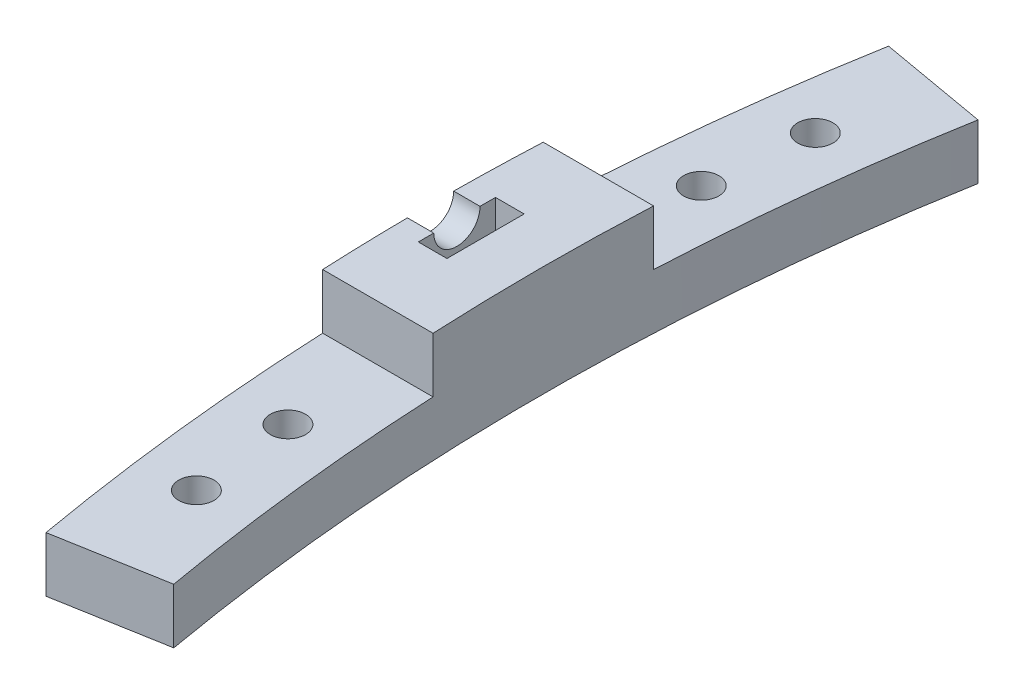
ISO-10303-21;
HEADER;
FILE_DESCRIPTION(('STEP AP214'),'2;1');
FILE_NAME('part.step','',(''),(''),'','','');
FILE_SCHEMA(('AUTOMOTIVE_DESIGN { 1 0 10303 214 1 1 1 1 }'));
ENDSEC;
DATA;
#1=APPLICATION_CONTEXT('core data for automotive mechanical design processes');
#2=APPLICATION_PROTOCOL_DEFINITION('international standard','automotive_design',2000,#1);
#3=PRODUCT_CONTEXT('',#1,'mechanical');
#4=PRODUCT('Part','Part','',(#3));
#5=PRODUCT_RELATED_PRODUCT_CATEGORY('part','',(#4));
#6=PRODUCT_DEFINITION_FORMATION('','',#4);
#7=PRODUCT_DEFINITION_CONTEXT('part definition',#1,'design');
#8=PRODUCT_DEFINITION('design','',#6,#7);
#9=PRODUCT_DEFINITION_SHAPE('','',#8);
#10=(LENGTH_UNIT() NAMED_UNIT(*) SI_UNIT(.MILLI.,.METRE.));
#11=(NAMED_UNIT(*) PLANE_ANGLE_UNIT() SI_UNIT($,.RADIAN.));
#12=(NAMED_UNIT(*) SI_UNIT($,.STERADIAN.) SOLID_ANGLE_UNIT());
#13=UNCERTAINTY_MEASURE_WITH_UNIT(LENGTH_MEASURE(1.E-05),#10,'distance_accuracy_value','');
#14=(GEOMETRIC_REPRESENTATION_CONTEXT(3) GLOBAL_UNCERTAINTY_ASSIGNED_CONTEXT((#13)) GLOBAL_UNIT_ASSIGNED_CONTEXT((#10,
#11,#12)) REPRESENTATION_CONTEXT('',''));
#15=CARTESIAN_POINT('',(0.,0.,0.));
#16=DIRECTION('',(0.,0.,1.));
#17=DIRECTION('',(1.,0.,0.));
#18=AXIS2_PLACEMENT_3D('',#15,#16,#17);
#19=CARTESIAN_POINT('',(0.,5.,0.));
#20=DIRECTION('',(0.,-1.,0.));
#21=DIRECTION('',(0.,0.,-1.));
#22=AXIS2_PLACEMENT_3D('',#19,#20,#21);
#23=CYLINDRICAL_SURFACE('',#22,220.);
#24=CARTESIAN_POINT('',(-219.98997704441,10.,-2.09999999999996));
#25=CARTESIAN_POINT('',(-219.989976911042,9.94092001166468,-2.09999960933127));
#26=CARTESIAN_POINT('',(-219.990000874328,9.88186832983182,-2.09750526136831));
#27=CARTESIAN_POINT('',(-219.99009558057,9.76418752994787,-2.08755430155971));
#28=CARTESIAN_POINT('',(-219.99016632128,9.70555839173003,-2.08009792814349));
#29=CARTESIAN_POINT('',(-219.990446294195,9.53103130266999,-2.05035560793704));
#30=CARTESIAN_POINT('',(-219.990723286023,9.41630250237675,-2.0206962715008));
#31=CARTESIAN_POINT('',(-219.991427221332,9.19345826806721,-1.94253913729725));
#32=CARTESIAN_POINT('',(-219.99185423424,9.08534592328178,-1.89403261626762));
#33=CARTESIAN_POINT('',(-219.992809911719,8.87880452530947,-1.77956461367256));
#34=CARTESIAN_POINT('',(-219.993338556383,8.78037358140999,-1.7136065495979));
#35=CARTESIAN_POINT('',(-219.994438001129,8.59598009621957,-1.56610075067318));
#36=CARTESIAN_POINT('',(-219.995008803336,8.51001818397327,-1.48455222978784));
#37=CARTESIAN_POINT('',(-219.996128281511,8.35299070663296,-1.30816808911268));
#38=CARTESIAN_POINT('',(-219.996676954097,8.28192741208419,-1.21333044773352));
#39=CARTESIAN_POINT('',(-219.997690203637,8.15673428132634,-1.01307236083712));
#40=CARTESIAN_POINT('',(-219.998154782696,8.10260402099252,-0.907652180469999));
#41=CARTESIAN_POINT('',(-219.998947455408,8.01281390068889,-0.689226674319975));
#42=CARTESIAN_POINT('',(-219.999275557818,7.97715285570239,-0.576221835707479));
#43=CARTESIAN_POINT('',(-219.999758327978,7.92530880597583,-0.345829988207032));
#44=CARTESIAN_POINT('',(-219.999912997534,7.90912559841655,-0.22844302496248));
#45=CARTESIAN_POINT('',(-220.000031471933,7.89669592020705,0.00738451151938906));
#46=CARTESIAN_POINT('',(-219.999995272429,7.90044990365298,0.125825108693286));
#47=CARTESIAN_POINT('',(-219.999736085573,7.92778846433782,0.360389746817669));
#48=CARTESIAN_POINT('',(-219.999513106161,7.95137219848229,0.47651388604129));
#49=CARTESIAN_POINT('',(-219.998905508429,8.01769945452566,0.703154144133494));
#50=CARTESIAN_POINT('',(-219.998520890602,8.06044291772954,0.813670280180806));
#51=CARTESIAN_POINT('',(-219.997633354921,8.16387822288017,1.02596260460624));
#52=CARTESIAN_POINT('',(-219.997130432007,8.22457083241111,1.12773841896966));
#53=CARTESIAN_POINT('',(-219.996063019399,8.36217799662551,1.31965130152679));
#54=CARTESIAN_POINT('',(-219.99549853272,8.43909175730337,1.40978893904706));
#55=CARTESIAN_POINT('',(-219.994371656587,8.60695001575968,1.57586522601975));
#56=CARTESIAN_POINT('',(-219.99380926694,8.69789318881817,1.65180521458184));
#57=CARTESIAN_POINT('',(-219.992749751648,8.89127355177964,1.78736372488739));
#58=CARTESIAN_POINT('',(-219.992252646799,8.99371438474762,1.84697705278426));
#59=CARTESIAN_POINT('',(-219.99137969581,9.20719434450346,1.94818705669263));
#60=CARTESIAN_POINT('',(-219.991003923658,9.31823866657928,1.98977274502798));
#61=CARTESIAN_POINT('',(-219.990416998135,9.54564674673725,2.05364706406909));
#62=CARTESIAN_POINT('',(-219.990205593387,9.66200209265238,2.07596516760546));
#63=CARTESIAN_POINT('',(-219.990050937876,9.81594233860317,2.09224582074321));
#64=CARTESIAN_POINT('',(-219.990023241903,9.8527260911862,2.09515517356306));
#65=CARTESIAN_POINT('',(-219.989986319918,9.92633493060579,2.09902960844698));
#66=CARTESIAN_POINT('',(-219.989977063446,9.96315984855561,2.09999789706982));
#67=CARTESIAN_POINT('',(-219.98997704441,10.,2.10000000000004));
#68=B_SPLINE_CURVE_WITH_KNOTS('',3,(#24,#25,#26,#27,#28,#29,#30,#31,#32,#33,#34,#35,#36,#37,#38,
#39,#40,#41,#42,#43,#44,#45,#46,#47,#48,#49,#50,#51,#52,#53,#54,#55,#56,#57,#58,#59,#60,#61,#62,
#63,#64,#65,#66,#67),.UNSPECIFIED.,.F.,.F.,(4,2,2,2,2,2,2,2,2,2,2,2,2,2,2,2,2,2,2,2,2,4),(0.,
0.177131095388177,0.354253680095445,0.707932624361385,1.06177546135122,1.41554905742823,
1.76934049466937,2.12318581049765,2.47702226278944,2.83083600951124,3.1846460720024,
3.53846419302493,3.89226727164912,4.24606926641972,4.59988639350286,4.95368620568603,
5.30745263093121,5.66133146617636,6.01542568501934,6.36897729592022,6.47963752238336,
6.59011479152868),.UNSPECIFIED.);
#69=CARTESIAN_POINT('',(-219.98997704441,10.,-2.09999999999996));
#70=VERTEX_POINT('',#69);
#71=CARTESIAN_POINT('',(-219.98997704441,10.,2.10000000000004));
#72=VERTEX_POINT('',#71);
#73=EDGE_CURVE('E168',#70,#72,#68,.T.);
#74=ORIENTED_EDGE('',*,*,#73,.F.);
#75=CARTESIAN_POINT('',(0.,10.,0.));
#76=DIRECTION('',(0.,1.,0.));
#77=DIRECTION('',(0.,0.,1.));
#78=AXIS2_PLACEMENT_3D('',#75,#76,#77);
#79=CIRCLE('',#78,220.);
#80=CARTESIAN_POINT('',(-219.772609758359,10.,-9.99999999999996));
#81=VERTEX_POINT('',#80);
#82=EDGE_CURVE('E145',#81,#70,#79,.T.);
#83=ORIENTED_EDGE('',*,*,#82,.F.);
#84=DIRECTION('',(0.,-1.,0.));
#85=VECTOR('',#84,1.);
#86=CARTESIAN_POINT('',(-219.772609758359,10.,-9.99999999999996));
#87=LINE('',#86,#85);
#88=CARTESIAN_POINT('',(-219.772609758359,5.,-9.99999999999996));
#89=VERTEX_POINT('',#88);
#90=EDGE_CURVE('E184',#81,#89,#87,.T.);
#91=ORIENTED_EDGE('',*,*,#90,.T.);
#92=CARTESIAN_POINT('',(0.,5.,0.));
#93=DIRECTION('',(0.,1.,0.));
#94=DIRECTION('',(0.,0.,1.));
#95=AXIS2_PLACEMENT_3D('',#92,#93,#94);
#96=CIRCLE('',#95,220.);
#97=CARTESIAN_POINT('',(-216.657705662686,5.,-38.2025990867247));
#98=VERTEX_POINT('',#97);
#99=EDGE_CURVE('E226',#98,#89,#96,.T.);
#100=ORIENTED_EDGE('',*,*,#99,.F.);
#101=DIRECTION('',(0.,-1.,0.));
#102=VECTOR('',#101,1.);
#103=CARTESIAN_POINT('',(-216.657705662686,5.,-38.2025990867247));
#104=LINE('',#103,#102);
#105=CARTESIAN_POINT('',(-216.657705662686,0.,-38.2025990867247));
#106=VERTEX_POINT('',#105);
#107=EDGE_CURVE('E236',#98,#106,#104,.T.);
#108=ORIENTED_EDGE('',*,*,#107,.T.);
#109=CARTESIAN_POINT('',(0.,0.,0.));
#110=DIRECTION('',(0.,1.,0.));
#111=DIRECTION('',(0.,0.,1.));
#112=AXIS2_PLACEMENT_3D('',#109,#110,#111);
#113=CIRCLE('',#112,220.);
#114=CARTESIAN_POINT('',(-216.657705662686,0.,38.2025990867248));
#115=VERTEX_POINT('',#114);
#116=EDGE_CURVE('E225',#106,#115,#113,.T.);
#117=ORIENTED_EDGE('',*,*,#116,.T.);
#118=DIRECTION('',(0.,-1.,0.));
#119=VECTOR('',#118,1.);
#120=CARTESIAN_POINT('',(-216.657705662686,5.,38.2025990867248));
#121=LINE('',#120,#119);
#122=CARTESIAN_POINT('',(-216.657705662686,5.,38.2025990867248));
#123=VERTEX_POINT('',#122);
#124=EDGE_CURVE('E253',#123,#115,#121,.T.);
#125=ORIENTED_EDGE('',*,*,#124,.F.);
#126=CARTESIAN_POINT('',(-219.772609758359,5.,10.));
#127=VERTEX_POINT('',#126);
#128=EDGE_CURVE('E229',#127,#123,#96,.T.);
#129=ORIENTED_EDGE('',*,*,#128,.F.);
#130=DIRECTION('',(0.,-1.,0.));
#131=VECTOR('',#130,1.);
#132=CARTESIAN_POINT('',(-219.772609758359,10.,10.));
#133=LINE('',#132,#131);
#134=CARTESIAN_POINT('',(-219.772609758359,10.,10.));
#135=VERTEX_POINT('',#134);
#136=EDGE_CURVE('E198',#135,#127,#133,.T.);
#137=ORIENTED_EDGE('',*,*,#136,.F.);
#138=EDGE_CURVE('E178',#72,#135,#79,.T.);
#139=ORIENTED_EDGE('',*,*,#138,.F.);
#140=EDGE_LOOP('',(#74,#83,#91,#100,#108,#117,#125,#129,#137,#139));
#141=FACE_BOUND('',#140,.T.);
#142=ADVANCED_FACE('F34',(#141),#23,.T.);
#143=CARTESIAN_POINT('',(0.,10.,0.));
#144=DIRECTION('',(0.,1.,0.));
#145=DIRECTION('',(0.,0.,1.));
#146=AXIS2_PLACEMENT_3D('',#143,#144,#145);
#147=PLANE('',#146);
#148=DIRECTION('',(0.,0.,1.));
#149=VECTOR('',#148,1.);
#150=CARTESIAN_POINT('',(-217.6,10.,0.));
#151=LINE('',#150,#149);
#152=CARTESIAN_POINT('',(-217.6,10.,2.10000000000004));
#153=VERTEX_POINT('',#152);
#154=CARTESIAN_POINT('',(-217.6,10.,3.50000000000003));
#155=VERTEX_POINT('',#154);
#156=EDGE_CURVE('E42',#153,#155,#151,.T.);
#157=ORIENTED_EDGE('',*,*,#156,.F.);
#158=DIRECTION('',(1.,0.,0.));
#159=VECTOR('',#158,1.);
#160=CARTESIAN_POINT('',(-220.,10.,2.10000000000004));
#161=LINE('',#160,#159);
#162=EDGE_CURVE('E49',#153,#72,#161,.F.);
#163=ORIENTED_EDGE('',*,*,#162,.T.);
#164=ORIENTED_EDGE('',*,*,#138,.T.);
#165=DIRECTION('',(1.,0.,0.));
#166=VECTOR('',#165,1.);
#167=CARTESIAN_POINT('',(-219.772609758359,10.,10.));
#168=LINE('',#167,#166);
#169=CARTESIAN_POINT('',(-209.76176963403,10.,10.));
#170=VERTEX_POINT('',#169);
#171=EDGE_CURVE('E177',#135,#170,#168,.T.);
#172=ORIENTED_EDGE('',*,*,#171,.T.);
#173=CARTESIAN_POINT('',(0.,10.,0.));
#174=DIRECTION('',(0.,-1.,0.));
#175=DIRECTION('',(0.,0.,1.));
#176=AXIS2_PLACEMENT_3D('',#173,#174,#175);
#177=CIRCLE('',#176,210.);
#178=CARTESIAN_POINT('',(-209.76176963403,10.,-10.0000000000001));
#179=VERTEX_POINT('',#178);
#180=EDGE_CURVE('E180',#170,#179,#177,.T.);
#181=ORIENTED_EDGE('',*,*,#180,.T.);
#182=DIRECTION('',(-1.,0.,0.));
#183=VECTOR('',#182,1.);
#184=CARTESIAN_POINT('',(-219.772609758359,10.,-9.99999999999996));
#185=LINE('',#184,#183);
#186=EDGE_CURVE('E182',#179,#81,#185,.T.);
#187=ORIENTED_EDGE('',*,*,#186,.T.);
#188=ORIENTED_EDGE('',*,*,#82,.T.);
#189=DIRECTION('',(1.,0.,0.));
#190=VECTOR('',#189,1.);
#191=CARTESIAN_POINT('',(-220.,10.,-2.09999999999996));
#192=LINE('',#191,#190);
#193=CARTESIAN_POINT('',(-217.6,10.,-2.09999999999996));
#194=VERTEX_POINT('',#193);
#195=EDGE_CURVE('E136',#70,#194,#192,.T.);
#196=ORIENTED_EDGE('',*,*,#195,.T.);
#197=CARTESIAN_POINT('',(-217.6,10.,-3.49999999999997));
#198=VERTEX_POINT('',#197);
#199=EDGE_CURVE('E11',#198,#194,#151,.T.);
#200=ORIENTED_EDGE('',*,*,#199,.F.);
#201=DIRECTION('',(1.,0.,0.));
#202=VECTOR('',#201,1.);
#203=CARTESIAN_POINT('',(0.,10.,-3.5));
#204=LINE('',#203,#202);
#205=CARTESIAN_POINT('',(-215.,10.,-3.49999999999997));
#206=VERTEX_POINT('',#205);
#207=EDGE_CURVE('E257',#198,#206,#204,.T.);
#208=ORIENTED_EDGE('',*,*,#207,.T.);
#209=DIRECTION('',(0.,0.,1.));
#210=VECTOR('',#209,1.);
#211=CARTESIAN_POINT('',(-215.,10.,0.));
#212=LINE('',#211,#210);
#213=CARTESIAN_POINT('',(-215.,10.,3.50000000000003));
#214=VERTEX_POINT('',#213);
#215=EDGE_CURVE('E57',#206,#214,#212,.T.);
#216=ORIENTED_EDGE('',*,*,#215,.T.);
#217=DIRECTION('',(-1.,0.,0.));
#218=VECTOR('',#217,1.);
#219=CARTESIAN_POINT('',(0.,10.,3.5));
#220=LINE('',#219,#218);
#221=EDGE_CURVE('E258',#214,#155,#220,.T.);
#222=ORIENTED_EDGE('',*,*,#221,.T.);
#223=EDGE_LOOP('',(#157,#163,#164,#172,#181,#187,#188,#196,#200,#208,#216,#222));
#224=FACE_BOUND('',#223,.T.);
#225=ADVANCED_FACE('F143',(#224),#147,.T.);
#226=CARTESIAN_POINT('',(0.,5.,0.));
#227=DIRECTION('',(0.,1.,0.));
#228=DIRECTION('',(0.,0.,1.));
#229=AXIS2_PLACEMENT_3D('',#226,#227,#228);
#230=PLANE('',#229);
#231=DIRECTION('',(-1.,0.,0.));
#232=VECTOR('',#231,1.);
#233=CARTESIAN_POINT('',(-219.772609758359,5.,-9.99999999999996));
#234=LINE('',#233,#232);
#235=CARTESIAN_POINT('',(-209.76176963403,5.,-9.99999999999996));
#236=VERTEX_POINT('',#235);
#237=EDGE_CURVE('E187',#236,#89,#234,.T.);
#238=ORIENTED_EDGE('',*,*,#237,.F.);
#239=CARTESIAN_POINT('',(0.,5.,0.));
#240=DIRECTION('',(0.,-1.,0.));
#241=DIRECTION('',(0.,0.,1.));
#242=AXIS2_PLACEMENT_3D('',#239,#240,#241);
#243=CIRCLE('',#242,210.);
#244=CARTESIAN_POINT('',(-206.809628132564,5.,-36.4661173100554));
#245=VERTEX_POINT('',#244);
#246=EDGE_CURVE('E231',#236,#245,#243,.T.);
#247=ORIENTED_EDGE('',*,*,#246,.T.);
#248=DIRECTION('',(-0.984807753012208,0.,-0.173648177666932));
#249=VECTOR('',#248,1.);
#250=CARTESIAN_POINT('',(-216.657705662686,5.,-38.2025990867247));
#251=LINE('',#250,#249);
#252=EDGE_CURVE('E234',#245,#98,#251,.T.);
#253=ORIENTED_EDGE('',*,*,#252,.T.);
#254=ORIENTED_EDGE('',*,*,#99,.T.);
#255=EDGE_LOOP('',(#238,#247,#253,#254));
#256=FACE_BOUND('',#255,.T.);
#257=CARTESIAN_POINT('',(-213.160645195369,5.,-28.0631313273112));
#258=DIRECTION('',(0.,-1.,0.));
#259=DIRECTION('',(0.,0.,-1.));
#260=AXIS2_PLACEMENT_3D('',#257,#258,#259);
#261=CIRCLE('',#260,1.59999999999999);
#262=CARTESIAN_POINT('',(-213.160645195369,5.,-29.6631313273112));
#263=VERTEX_POINT('',#262);
#264=EDGE_CURVE('E222',#263,#263,#261,.T.);
#265=ORIENTED_EDGE('',*,*,#264,.T.);
#266=EDGE_LOOP('',(#265));
#267=FACE_BOUND('',#266,.T.);
#268=CARTESIAN_POINT('',(-214.181860089725,5.,-18.7384846907466));
#269=DIRECTION('',(0.,-1.,0.));
#270=DIRECTION('',(0.,0.,-1.));
#271=AXIS2_PLACEMENT_3D('',#268,#269,#270);
#272=CIRCLE('',#271,1.59999999999999);
#273=CARTESIAN_POINT('',(-214.181860089725,5.,-20.3384846907466));
#274=VERTEX_POINT('',#273);
#275=EDGE_CURVE('E210',#274,#274,#272,.T.);
#276=ORIENTED_EDGE('',*,*,#275,.T.);
#277=EDGE_LOOP('',(#276));
#278=FACE_BOUND('',#277,.T.);
#279=ADVANCED_FACE('F285',(#256,#267,#278),#230,.T.);
#280=CARTESIAN_POINT('',(-206.809628132564,5.,36.4661173100555));
#281=DIRECTION('',(-0.173648177666932,0.,-0.984807753012208));
#282=DIRECTION('',(-0.984807753012208,0.,0.173648177666932));
#283=AXIS2_PLACEMENT_3D('',#280,#281,#282);
#284=PLANE('',#283);
#285=DIRECTION('',(0.984807753012208,0.,-0.173648177666932));
#286=VECTOR('',#285,1.);
#287=CARTESIAN_POINT('',(-206.809628132564,0.,36.4661173100555));
#288=LINE('',#287,#286);
#289=CARTESIAN_POINT('',(-206.809628132564,0.,36.4661173100555));
#290=VERTEX_POINT('',#289);
#291=EDGE_CURVE('E239',#115,#290,#288,.T.);
#292=ORIENTED_EDGE('',*,*,#291,.T.);
#293=DIRECTION('',(0.,-1.,0.));
#294=VECTOR('',#293,1.);
#295=CARTESIAN_POINT('',(-206.809628132564,5.,36.4661173100555));
#296=LINE('',#295,#294);
#297=CARTESIAN_POINT('',(-206.809628132564,5.,36.4661173100555));
#298=VERTEX_POINT('',#297);
#299=EDGE_CURVE('E250',#298,#290,#296,.T.);
#300=ORIENTED_EDGE('',*,*,#299,.F.);
#301=DIRECTION('',(0.984807753012208,0.,-0.173648177666932));
#302=VECTOR('',#301,1.);
#303=CARTESIAN_POINT('',(-206.809628132564,5.,36.4661173100555));
#304=LINE('',#303,#302);
#305=EDGE_CURVE('E228',#123,#298,#304,.T.);
#306=ORIENTED_EDGE('',*,*,#305,.F.);
#307=ORIENTED_EDGE('',*,*,#124,.T.);
#308=EDGE_LOOP('',(#292,#300,#306,#307));
#309=FACE_BOUND('',#308,.T.);
#310=ADVANCED_FACE('F308',(#309),#284,.F.);
#311=CARTESIAN_POINT('',(0.,5.,0.));
#312=DIRECTION('',(0.,-1.,0.));
#313=DIRECTION('',(0.,0.,-1.));
#314=AXIS2_PLACEMENT_3D('',#311,#312,#313);
#315=CYLINDRICAL_SURFACE('',#314,210.);
#316=CARTESIAN_POINT('',(0.,0.,0.));
#317=DIRECTION('',(0.,-1.,0.));
#318=DIRECTION('',(0.,0.,1.));
#319=AXIS2_PLACEMENT_3D('',#316,#317,#318);
#320=CIRCLE('',#319,210.);
#321=CARTESIAN_POINT('',(-206.809628132564,0.,-36.4661173100554));
#322=VERTEX_POINT('',#321);
#323=EDGE_CURVE('E241',#290,#322,#320,.T.);
#324=ORIENTED_EDGE('',*,*,#323,.T.);
#325=DIRECTION('',(0.,-1.,0.));
#326=VECTOR('',#325,1.);
#327=CARTESIAN_POINT('',(-206.809628132564,5.,-36.4661173100554));
#328=LINE('',#327,#326);
#329=EDGE_CURVE('E247',#245,#322,#328,.T.);
#330=ORIENTED_EDGE('',*,*,#329,.F.);
#331=ORIENTED_EDGE('',*,*,#246,.F.);
#332=DIRECTION('',(0.,-1.,0.));
#333=VECTOR('',#332,1.);
#334=CARTESIAN_POINT('',(-209.76176963403,10.,-10.0000000000001));
#335=LINE('',#334,#333);
#336=EDGE_CURVE('E192',#179,#236,#335,.T.);
#337=ORIENTED_EDGE('',*,*,#336,.F.);
#338=ORIENTED_EDGE('',*,*,#180,.F.);
#339=DIRECTION('',(0.,-1.,0.));
#340=VECTOR('',#339,1.);
#341=CARTESIAN_POINT('',(-209.76176963403,10.,10.));
#342=LINE('',#341,#340);
#343=CARTESIAN_POINT('',(-209.76176963403,5.,10.));
#344=VERTEX_POINT('',#343);
#345=EDGE_CURVE('E195',#170,#344,#342,.T.);
#346=ORIENTED_EDGE('',*,*,#345,.T.);
#347=EDGE_CURVE('E232',#298,#344,#243,.T.);
#348=ORIENTED_EDGE('',*,*,#347,.F.);
#349=ORIENTED_EDGE('',*,*,#299,.T.);
#350=EDGE_LOOP('',(#324,#330,#331,#337,#338,#346,#348,#349));
#351=FACE_BOUND('',#350,.T.);
#352=ADVANCED_FACE('F312',(#351),#315,.F.);
#353=CARTESIAN_POINT('',(-216.657705662686,5.,-38.2025990867247));
#354=DIRECTION('',(-0.173648177666932,0.,0.984807753012208));
#355=DIRECTION('',(0.984807753012208,0.,0.173648177666932));
#356=AXIS2_PLACEMENT_3D('',#353,#354,#355);
#357=PLANE('',#356);
#358=DIRECTION('',(-0.984807753012208,0.,-0.173648177666932));
#359=VECTOR('',#358,1.);
#360=CARTESIAN_POINT('',(-216.657705662686,0.,-38.2025990867247));
#361=LINE('',#360,#359);
#362=EDGE_CURVE('E243',#322,#106,#361,.T.);
#363=ORIENTED_EDGE('',*,*,#362,.T.);
#364=ORIENTED_EDGE('',*,*,#107,.F.);
#365=ORIENTED_EDGE('',*,*,#252,.F.);
#366=ORIENTED_EDGE('',*,*,#329,.T.);
#367=EDGE_LOOP('',(#363,#364,#365,#366));
#368=FACE_BOUND('',#367,.T.);
#369=ADVANCED_FACE('F327',(#368),#357,.F.);
#370=DIRECTION('',(1.,0.,0.));
#371=VECTOR('',#370,1.);
#372=CARTESIAN_POINT('',(-219.772609758359,5.,10.));
#373=LINE('',#372,#371);
#374=EDGE_CURVE('E175',#127,#344,#373,.T.);
#375=ORIENTED_EDGE('',*,*,#374,.F.);
#376=ORIENTED_EDGE('',*,*,#128,.T.);
#377=ORIENTED_EDGE('',*,*,#305,.T.);
#378=ORIENTED_EDGE('',*,*,#347,.T.);
#379=EDGE_LOOP('',(#375,#376,#377,#378));
#380=FACE_BOUND('',#379,.T.);
#381=CARTESIAN_POINT('',(-214.181860089725,5.,18.7384846907465));
#382=DIRECTION('',(0.,-1.,0.));
#383=DIRECTION('',(0.,0.,-1.));
#384=AXIS2_PLACEMENT_3D('',#381,#382,#383);
#385=CIRCLE('',#384,1.59999999999999);
#386=CARTESIAN_POINT('',(-214.181860089725,5.,17.1384846907466));
#387=VERTEX_POINT('',#386);
#388=EDGE_CURVE('E204',#387,#387,#385,.T.);
#389=ORIENTED_EDGE('',*,*,#388,.T.);
#390=EDGE_LOOP('',(#389));
#391=FACE_BOUND('',#390,.T.);
#392=CARTESIAN_POINT('',(-213.160645195369,5.,28.0631313273111));
#393=DIRECTION('',(0.,-1.,0.));
#394=DIRECTION('',(0.,0.,-1.));
#395=AXIS2_PLACEMENT_3D('',#392,#393,#394);
#396=CIRCLE('',#395,1.59999999999999);
#397=CARTESIAN_POINT('',(-213.160645195369,5.,26.4631313273111));
#398=VERTEX_POINT('',#397);
#399=EDGE_CURVE('E216',#398,#398,#396,.T.);
#400=ORIENTED_EDGE('',*,*,#399,.T.);
#401=EDGE_LOOP('',(#400));
#402=FACE_BOUND('',#401,.T.);
#403=ADVANCED_FACE('F304',(#380,#391,#402),#230,.T.);
#404=CARTESIAN_POINT('',(0.,0.,0.));
#405=DIRECTION('',(0.,1.,0.));
#406=DIRECTION('',(0.,0.,1.));
#407=AXIS2_PLACEMENT_3D('',#404,#405,#406);
#408=PLANE('',#407);
#409=CARTESIAN_POINT('',(-214.181860089725,0.,18.7384846907465));
#410=DIRECTION('',(0.,-1.,0.));
#411=DIRECTION('',(0.,0.,-1.));
#412=AXIS2_PLACEMENT_3D('',#409,#410,#411);
#413=CIRCLE('',#412,1.59999999999999);
#414=CARTESIAN_POINT('',(-214.181860089725,0.,17.1384846907466));
#415=VERTEX_POINT('',#414);
#416=EDGE_CURVE('E201',#415,#415,#413,.T.);
#417=ORIENTED_EDGE('',*,*,#416,.F.);
#418=EDGE_LOOP('',(#417));
#419=FACE_BOUND('',#418,.T.);
#420=CARTESIAN_POINT('',(-214.181860089725,0.,-18.7384846907466));
#421=DIRECTION('',(0.,-1.,0.));
#422=DIRECTION('',(0.,0.,-1.));
#423=AXIS2_PLACEMENT_3D('',#420,#421,#422);
#424=CIRCLE('',#423,1.59999999999999);
#425=CARTESIAN_POINT('',(-214.181860089725,0.,-20.3384846907466));
#426=VERTEX_POINT('',#425);
#427=EDGE_CURVE('E207',#426,#426,#424,.T.);
#428=ORIENTED_EDGE('',*,*,#427,.F.);
#429=EDGE_LOOP('',(#428));
#430=FACE_BOUND('',#429,.T.);
#431=CARTESIAN_POINT('',(-213.160645195369,0.,28.0631313273111));
#432=DIRECTION('',(0.,-1.,0.));
#433=DIRECTION('',(0.,0.,-1.));
#434=AXIS2_PLACEMENT_3D('',#431,#432,#433);
#435=CIRCLE('',#434,1.59999999999999);
#436=CARTESIAN_POINT('',(-213.160645195369,0.,26.4631313273111));
#437=VERTEX_POINT('',#436);
#438=EDGE_CURVE('E213',#437,#437,#435,.T.);
#439=ORIENTED_EDGE('',*,*,#438,.F.);
#440=EDGE_LOOP('',(#439));
#441=FACE_BOUND('',#440,.T.);
#442=CARTESIAN_POINT('',(-213.160645195369,0.,-28.0631313273112));
#443=DIRECTION('',(0.,-1.,0.));
#444=DIRECTION('',(0.,0.,-1.));
#445=AXIS2_PLACEMENT_3D('',#442,#443,#444);
#446=CIRCLE('',#445,1.59999999999999);
#447=CARTESIAN_POINT('',(-213.160645195369,0.,-29.6631313273112));
#448=VERTEX_POINT('',#447);
#449=EDGE_CURVE('E219',#448,#448,#446,.T.);
#450=ORIENTED_EDGE('',*,*,#449,.F.);
#451=EDGE_LOOP('',(#450));
#452=FACE_BOUND('',#451,.T.);
#453=ORIENTED_EDGE('',*,*,#116,.F.);
#454=ORIENTED_EDGE('',*,*,#362,.F.);
#455=ORIENTED_EDGE('',*,*,#323,.F.);
#456=ORIENTED_EDGE('',*,*,#291,.F.);
#457=EDGE_LOOP('',(#453,#454,#455,#456));
#458=FACE_BOUND('',#457,.T.);
#459=ADVANCED_FACE('F330',(#419,#430,#441,#452,#458),#408,.F.);
#460=CARTESIAN_POINT('',(-213.160645195369,0.,-28.0631313273112));
#461=DIRECTION('',(0.,-1.,0.));
#462=DIRECTION('',(0.,0.,-1.));
#463=AXIS2_PLACEMENT_3D('',#460,#461,#462);
#464=CYLINDRICAL_SURFACE('',#463,1.59999999999999);
#465=ORIENTED_EDGE('',*,*,#264,.F.);
#466=EDGE_LOOP('',(#465));
#467=FACE_BOUND('',#466,.T.);
#468=ORIENTED_EDGE('',*,*,#449,.T.);
#469=EDGE_LOOP('',(#468));
#470=FACE_BOUND('',#469,.T.);
#471=ADVANCED_FACE('F332',(#467,#470),#464,.F.);
#472=CARTESIAN_POINT('',(-213.160645195369,0.,28.0631313273111));
#473=DIRECTION('',(0.,-1.,0.));
#474=DIRECTION('',(0.,0.,-1.));
#475=AXIS2_PLACEMENT_3D('',#472,#473,#474);
#476=CYLINDRICAL_SURFACE('',#475,1.59999999999999);
#477=ORIENTED_EDGE('',*,*,#399,.F.);
#478=EDGE_LOOP('',(#477));
#479=FACE_BOUND('',#478,.T.);
#480=ORIENTED_EDGE('',*,*,#438,.T.);
#481=EDGE_LOOP('',(#480));
#482=FACE_BOUND('',#481,.T.);
#483=ADVANCED_FACE('F339',(#479,#482),#476,.F.);
#484=CARTESIAN_POINT('',(-214.181860089725,0.,-18.7384846907466));
#485=DIRECTION('',(0.,-1.,0.));
#486=DIRECTION('',(0.,0.,-1.));
#487=AXIS2_PLACEMENT_3D('',#484,#485,#486);
#488=CYLINDRICAL_SURFACE('',#487,1.59999999999999);
#489=ORIENTED_EDGE('',*,*,#275,.F.);
#490=EDGE_LOOP('',(#489));
#491=FACE_BOUND('',#490,.T.);
#492=ORIENTED_EDGE('',*,*,#427,.T.);
#493=EDGE_LOOP('',(#492));
#494=FACE_BOUND('',#493,.T.);
#495=ADVANCED_FACE('F422',(#491,#494),#488,.F.);
#496=CARTESIAN_POINT('',(-214.181860089725,0.,18.7384846907465));
#497=DIRECTION('',(0.,-1.,0.));
#498=DIRECTION('',(0.,0.,-1.));
#499=AXIS2_PLACEMENT_3D('',#496,#497,#498);
#500=CYLINDRICAL_SURFACE('',#499,1.59999999999999);
#501=ORIENTED_EDGE('',*,*,#388,.F.);
#502=EDGE_LOOP('',(#501));
#503=FACE_BOUND('',#502,.T.);
#504=ORIENTED_EDGE('',*,*,#416,.T.);
#505=EDGE_LOOP('',(#504));
#506=FACE_BOUND('',#505,.T.);
#507=ADVANCED_FACE('F415',(#503,#506),#500,.F.);
#508=CARTESIAN_POINT('',(-219.772609758359,10.,10.));
#509=DIRECTION('',(0.,0.,-1.));
#510=DIRECTION('',(-1.,0.,0.));
#511=AXIS2_PLACEMENT_3D('',#508,#509,#510);
#512=PLANE('',#511);
#513=ORIENTED_EDGE('',*,*,#374,.T.);
#514=ORIENTED_EDGE('',*,*,#345,.F.);
#515=ORIENTED_EDGE('',*,*,#171,.F.);
#516=ORIENTED_EDGE('',*,*,#136,.T.);
#517=EDGE_LOOP('',(#513,#514,#515,#516));
#518=FACE_BOUND('',#517,.T.);
#519=ADVANCED_FACE('F298',(#518),#512,.F.);
#520=CARTESIAN_POINT('',(-219.772609758359,10.,-9.99999999999996));
#521=DIRECTION('',(0.,0.,1.));
#522=DIRECTION('',(1.,0.,0.));
#523=AXIS2_PLACEMENT_3D('',#520,#521,#522);
#524=PLANE('',#523);
#525=ORIENTED_EDGE('',*,*,#237,.T.);
#526=ORIENTED_EDGE('',*,*,#90,.F.);
#527=ORIENTED_EDGE('',*,*,#186,.F.);
#528=ORIENTED_EDGE('',*,*,#336,.T.);
#529=EDGE_LOOP('',(#525,#526,#527,#528));
#530=FACE_BOUND('',#529,.T.);
#531=ADVANCED_FACE('F318',(#530),#524,.F.);
#532=CARTESIAN_POINT('',(-217.6,13.5,3.50000000000003));
#533=DIRECTION('',(0.,0.,-1.));
#534=DIRECTION('',(0.,1.,0.));
#535=AXIS2_PLACEMENT_3D('',#532,#533,#534);
#536=PLANE('',#535);
#537=DIRECTION('',(0.,1.,0.));
#538=VECTOR('',#537,1.);
#539=CARTESIAN_POINT('',(-215.,13.5,3.50000000000003));
#540=LINE('',#539,#538);
#541=CARTESIAN_POINT('',(-215.,6.5,3.50000000000003));
#542=VERTEX_POINT('',#541);
#543=EDGE_CURVE('E165',#542,#214,#540,.T.);
#544=ORIENTED_EDGE('',*,*,#543,.F.);
#545=DIRECTION('',(1.,0.,0.));
#546=VECTOR('',#545,1.);
#547=CARTESIAN_POINT('',(-217.6,6.5,3.50000000000003));
#548=LINE('',#547,#546);
#549=CARTESIAN_POINT('',(-217.6,6.5,3.50000000000003));
#550=VERTEX_POINT('',#549);
#551=EDGE_CURVE('E158',#550,#542,#548,.T.);
#552=ORIENTED_EDGE('',*,*,#551,.F.);
#553=DIRECTION('',(0.,1.,0.));
#554=VECTOR('',#553,1.);
#555=CARTESIAN_POINT('',(-217.6,13.5,3.50000000000003));
#556=LINE('',#555,#554);
#557=EDGE_CURVE('E156',#550,#155,#556,.T.);
#558=ORIENTED_EDGE('',*,*,#557,.T.);
#559=ORIENTED_EDGE('',*,*,#221,.F.);
#560=EDGE_LOOP('',(#544,#552,#558,#559));
#561=FACE_BOUND('',#560,.T.);
#562=ADVANCED_FACE('F263',(#561),#536,.T.);
#563=CARTESIAN_POINT('',(-217.6,13.5,-3.49999999999997));
#564=DIRECTION('',(0.,0.,1.));
#565=DIRECTION('',(0.,-1.,0.));
#566=AXIS2_PLACEMENT_3D('',#563,#564,#565);
#567=PLANE('',#566);
#568=DIRECTION('',(0.,-1.,0.));
#569=VECTOR('',#568,1.);
#570=CARTESIAN_POINT('',(-217.6,13.5,-3.49999999999997));
#571=LINE('',#570,#569);
#572=CARTESIAN_POINT('',(-217.6,6.5,-3.49999999999997));
#573=VERTEX_POINT('',#572);
#574=EDGE_CURVE('E150',#198,#573,#571,.T.);
#575=ORIENTED_EDGE('',*,*,#574,.T.);
#576=DIRECTION('',(1.,0.,0.));
#577=VECTOR('',#576,1.);
#578=CARTESIAN_POINT('',(-217.6,6.5,-3.49999999999997));
#579=LINE('',#578,#577);
#580=CARTESIAN_POINT('',(-215.,6.5,-3.49999999999997));
#581=VERTEX_POINT('',#580);
#582=EDGE_CURVE('E173',#573,#581,#579,.T.);
#583=ORIENTED_EDGE('',*,*,#582,.T.);
#584=DIRECTION('',(0.,-1.,0.));
#585=VECTOR('',#584,1.);
#586=CARTESIAN_POINT('',(-215.,13.5,-3.49999999999997));
#587=LINE('',#586,#585);
#588=EDGE_CURVE('E167',#206,#581,#587,.T.);
#589=ORIENTED_EDGE('',*,*,#588,.F.);
#590=ORIENTED_EDGE('',*,*,#207,.F.);
#591=EDGE_LOOP('',(#575,#583,#589,#590));
#592=FACE_BOUND('',#591,.T.);
#593=ADVANCED_FACE('F268',(#592),#567,.T.);
#594=CARTESIAN_POINT('',(-217.6,6.5,-3.49999999999997));
#595=DIRECTION('',(0.,1.,0.));
#596=DIRECTION('',(0.,0.,1.));
#597=AXIS2_PLACEMENT_3D('',#594,#595,#596);
#598=PLANE('',#597);
#599=DIRECTION('',(0.,0.,1.));
#600=VECTOR('',#599,1.);
#601=CARTESIAN_POINT('',(-215.,6.5,-3.49999999999997));
#602=LINE('',#601,#600);
#603=EDGE_CURVE('E161',#581,#542,#602,.T.);
#604=ORIENTED_EDGE('',*,*,#603,.F.);
#605=ORIENTED_EDGE('',*,*,#582,.F.);
#606=DIRECTION('',(0.,0.,1.));
#607=VECTOR('',#606,1.);
#608=CARTESIAN_POINT('',(-217.6,6.5,-3.49999999999997));
#609=LINE('',#608,#607);
#610=EDGE_CURVE('E152',#573,#550,#609,.T.);
#611=ORIENTED_EDGE('',*,*,#610,.T.);
#612=ORIENTED_EDGE('',*,*,#551,.T.);
#613=EDGE_LOOP('',(#604,#605,#611,#612));
#614=FACE_BOUND('',#613,.T.);
#615=ADVANCED_FACE('F266',(#614),#598,.T.);
#616=CARTESIAN_POINT('',(-217.6,0.,0.));
#617=DIRECTION('',(-1.,0.,0.));
#618=DIRECTION('',(0.,0.,1.));
#619=AXIS2_PLACEMENT_3D('',#616,#617,#618);
#620=PLANE('',#619);
#621=CARTESIAN_POINT('',(-217.6,10.,0.));
#622=DIRECTION('',(-1.,0.,0.));
#623=DIRECTION('',(0.,0.,1.));
#624=AXIS2_PLACEMENT_3D('',#621,#622,#623);
#625=CIRCLE('',#624,2.1);
#626=EDGE_CURVE('E133',#153,#194,#625,.F.);
#627=ORIENTED_EDGE('',*,*,#626,.F.);
#628=ORIENTED_EDGE('',*,*,#156,.T.);
#629=ORIENTED_EDGE('',*,*,#557,.F.);
#630=ORIENTED_EDGE('',*,*,#610,.F.);
#631=ORIENTED_EDGE('',*,*,#574,.F.);
#632=ORIENTED_EDGE('',*,*,#199,.T.);
#633=EDGE_LOOP('',(#627,#628,#629,#630,#631,#632));
#634=FACE_BOUND('',#633,.T.);
#635=ADVANCED_FACE('F148',(#634),#620,.F.);
#636=CARTESIAN_POINT('',(-215.,0.,0.));
#637=DIRECTION('',(-1.,0.,0.));
#638=DIRECTION('',(0.,0.,1.));
#639=AXIS2_PLACEMENT_3D('',#636,#637,#638);
#640=PLANE('',#639);
#641=ORIENTED_EDGE('',*,*,#543,.T.);
#642=ORIENTED_EDGE('',*,*,#215,.F.);
#643=ORIENTED_EDGE('',*,*,#588,.T.);
#644=ORIENTED_EDGE('',*,*,#603,.T.);
#645=EDGE_LOOP('',(#641,#642,#643,#644));
#646=FACE_BOUND('',#645,.T.);
#647=ADVANCED_FACE('F270',(#646),#640,.T.);
#648=CARTESIAN_POINT('',(-220.,10.,0.));
#649=DIRECTION('',(1.,0.,0.));
#650=DIRECTION('',(0.,0.,-1.));
#651=AXIS2_PLACEMENT_3D('',#648,#649,#650);
#652=CYLINDRICAL_SURFACE('',#651,2.1);
#653=ORIENTED_EDGE('',*,*,#73,.T.);
#654=ORIENTED_EDGE('',*,*,#162,.F.);
#655=ORIENTED_EDGE('',*,*,#626,.T.);
#656=ORIENTED_EDGE('',*,*,#195,.F.);
#657=EDGE_LOOP('',(#653,#654,#655,#656));
#658=FACE_BOUND('',#657,.T.);
#659=ADVANCED_FACE('F135',(#658),#652,.F.);
#660=CLOSED_SHELL('',(#142,#225,#279,#310,#352,#369,#403,#459,#471,#483,#495,#507,#519,#531,
#562,#593,#615,#635,#647,#659));
#661=MANIFOLD_SOLID_BREP('B2',#660);
#662=ADVANCED_BREP_SHAPE_REPRESENTATION('',(#18,#661),#14);
#663=SHAPE_DEFINITION_REPRESENTATION(#9,#662);
ENDSEC;
END-ISO-10303-21;
